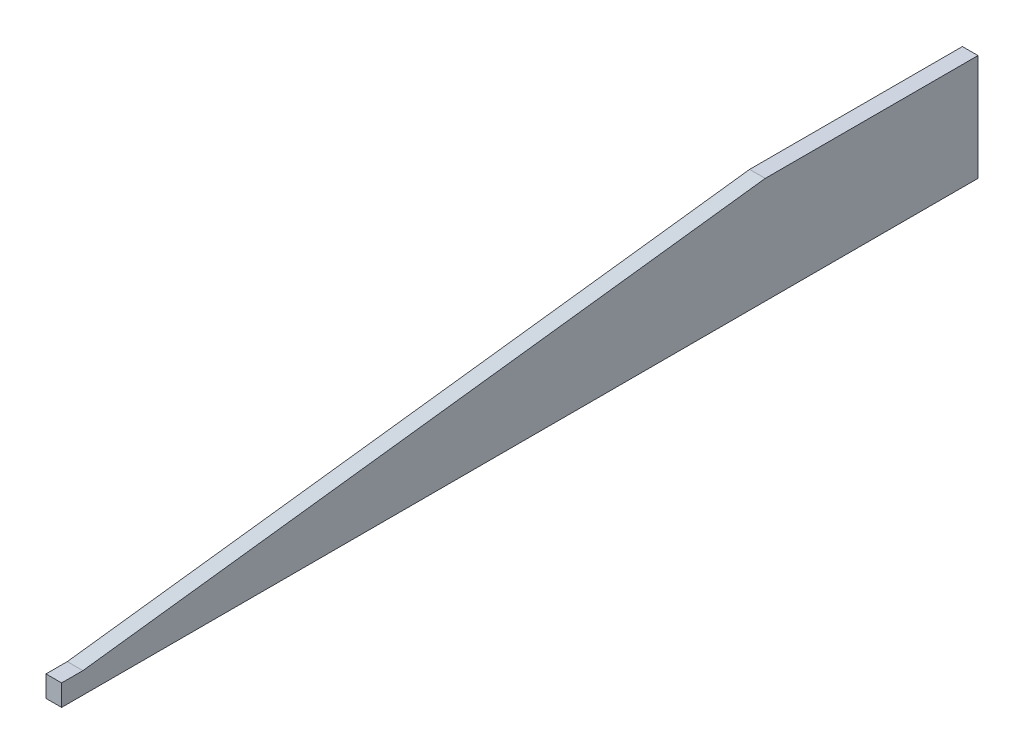
ISO-10303-21;
HEADER;
FILE_DESCRIPTION(('STEP AP214'),'2;1');
FILE_NAME('part.step','',(''),(''),'','','');
FILE_SCHEMA(('AUTOMOTIVE_DESIGN { 1 0 10303 214 1 1 1 1 }'));
ENDSEC;
DATA;
#1=APPLICATION_CONTEXT('core data for automotive mechanical design processes');
#2=APPLICATION_PROTOCOL_DEFINITION('international standard','automotive_design',2000,#1);
#3=PRODUCT_CONTEXT('',#1,'mechanical');
#4=PRODUCT('Part','Part','',(#3));
#5=PRODUCT_RELATED_PRODUCT_CATEGORY('part','',(#4));
#6=PRODUCT_DEFINITION_FORMATION('','',#4);
#7=PRODUCT_DEFINITION_CONTEXT('part definition',#1,'design');
#8=PRODUCT_DEFINITION('design','',#6,#7);
#9=PRODUCT_DEFINITION_SHAPE('','',#8);
#10=(LENGTH_UNIT() NAMED_UNIT(*) SI_UNIT(.MILLI.,.METRE.));
#11=(NAMED_UNIT(*) PLANE_ANGLE_UNIT() SI_UNIT($,.RADIAN.));
#12=(NAMED_UNIT(*) SI_UNIT($,.STERADIAN.) SOLID_ANGLE_UNIT());
#13=UNCERTAINTY_MEASURE_WITH_UNIT(LENGTH_MEASURE(1.E-05),#10,'distance_accuracy_value','');
#14=(GEOMETRIC_REPRESENTATION_CONTEXT(3) GLOBAL_UNCERTAINTY_ASSIGNED_CONTEXT((#13)) GLOBAL_UNIT_ASSIGNED_CONTEXT((#10,
#11,#12)) REPRESENTATION_CONTEXT('',''));
#15=CARTESIAN_POINT('',(0.,0.,0.));
#16=DIRECTION('',(0.,0.,1.));
#17=DIRECTION('',(1.,0.,0.));
#18=AXIS2_PLACEMENT_3D('',#15,#16,#17);
#19=CARTESIAN_POINT('',(-11.,75.,1292.));
#20=DIRECTION('',(1.,0.,0.));
#21=DIRECTION('',(0.,1.,0.));
#22=AXIS2_PLACEMENT_3D('',#19,#20,#21);
#23=PLANE('',#22);
#24=DIRECTION('',(0.,0.,-1.));
#25=VECTOR('',#24,1.);
#26=CARTESIAN_POINT('',(-11.,-45.,1262.));
#27=LINE('',#26,#25);
#28=CARTESIAN_POINT('',(-11.,-45.,1292.));
#29=VERTEX_POINT('',#28);
#30=CARTESIAN_POINT('',(-11.,-45.,1262.));
#31=VERTEX_POINT('',#30);
#32=EDGE_CURVE('E46',#29,#31,#27,.T.);
#33=ORIENTED_EDGE('',*,*,#32,.T.);
#34=DIRECTION('',(0.,0.123780821151756,-0.992309582899912));
#35=VECTOR('',#34,1.);
#36=CARTESIAN_POINT('',(-11.,75.,300.));
#37=LINE('',#36,#35);
#38=CARTESIAN_POINT('',(-11.,75.,300.));
#39=VERTEX_POINT('',#38);
#40=EDGE_CURVE('E81',#31,#39,#37,.T.);
#41=ORIENTED_EDGE('',*,*,#40,.T.);
#42=DIRECTION('',(0.,0.,-1.));
#43=VECTOR('',#42,1.);
#44=CARTESIAN_POINT('',(-11.,75.,1292.));
#45=LINE('',#44,#43);
#46=CARTESIAN_POINT('',(-11.,75.,0.));
#47=VERTEX_POINT('',#46);
#48=EDGE_CURVE('E75',#39,#47,#45,.T.);
#49=ORIENTED_EDGE('',*,*,#48,.T.);
#50=DIRECTION('',(0.,-1.,0.));
#51=VECTOR('',#50,1.);
#52=CARTESIAN_POINT('',(-11.,75.,0.));
#53=LINE('',#52,#51);
#54=CARTESIAN_POINT('',(-11.,-75.,0.));
#55=VERTEX_POINT('',#54);
#56=EDGE_CURVE('E79',#47,#55,#53,.T.);
#57=ORIENTED_EDGE('',*,*,#56,.T.);
#58=DIRECTION('',(0.,0.,-1.));
#59=VECTOR('',#58,1.);
#60=CARTESIAN_POINT('',(-11.,-75.,1292.));
#61=LINE('',#60,#59);
#62=CARTESIAN_POINT('',(-11.,-75.,1292.));
#63=VERTEX_POINT('',#62);
#64=EDGE_CURVE('E11',#63,#55,#61,.T.);
#65=ORIENTED_EDGE('',*,*,#64,.F.);
#66=DIRECTION('',(0.,-1.,0.));
#67=VECTOR('',#66,1.);
#68=CARTESIAN_POINT('',(-11.,75.,1292.));
#69=LINE('',#68,#67);
#70=EDGE_CURVE('E94',#29,#63,#69,.T.);
#71=ORIENTED_EDGE('',*,*,#70,.F.);
#72=EDGE_LOOP('',(#33,#41,#49,#57,#65,#71));
#73=FACE_BOUND('',#72,.T.);
#74=ADVANCED_FACE('F32',(#73),#23,.F.);
#75=CARTESIAN_POINT('',(-11.,-75.,1292.));
#76=DIRECTION('',(0.,1.,0.));
#77=DIRECTION('',(0.,0.,1.));
#78=AXIS2_PLACEMENT_3D('',#75,#76,#77);
#79=PLANE('',#78);
#80=DIRECTION('',(1.,0.,0.));
#81=VECTOR('',#80,1.);
#82=CARTESIAN_POINT('',(-11.,-75.,0.));
#83=LINE('',#82,#81);
#84=CARTESIAN_POINT('',(11.,-75.,0.));
#85=VERTEX_POINT('',#84);
#86=EDGE_CURVE('E98',#55,#85,#83,.T.);
#87=ORIENTED_EDGE('',*,*,#86,.T.);
#88=DIRECTION('',(0.,0.,-1.));
#89=VECTOR('',#88,1.);
#90=CARTESIAN_POINT('',(11.,-75.,1292.));
#91=LINE('',#90,#89);
#92=CARTESIAN_POINT('',(11.,-75.,1292.));
#93=VERTEX_POINT('',#92);
#94=EDGE_CURVE('E39',#93,#85,#91,.T.);
#95=ORIENTED_EDGE('',*,*,#94,.F.);
#96=DIRECTION('',(1.,0.,0.));
#97=VECTOR('',#96,1.);
#98=CARTESIAN_POINT('',(-11.,-75.,1292.));
#99=LINE('',#98,#97);
#100=EDGE_CURVE('E55',#63,#93,#99,.T.);
#101=ORIENTED_EDGE('',*,*,#100,.F.);
#102=ORIENTED_EDGE('',*,*,#64,.T.);
#103=EDGE_LOOP('',(#87,#95,#101,#102));
#104=FACE_BOUND('',#103,.T.);
#105=ADVANCED_FACE('F114',(#104),#79,.F.);
#106=CARTESIAN_POINT('',(11.,75.,1292.));
#107=DIRECTION('',(-1.,0.,0.));
#108=DIRECTION('',(0.,-1.,0.));
#109=AXIS2_PLACEMENT_3D('',#106,#107,#108);
#110=PLANE('',#109);
#111=DIRECTION('',(0.,0.,-1.));
#112=VECTOR('',#111,1.);
#113=CARTESIAN_POINT('',(11.,75.,1292.));
#114=LINE('',#113,#112);
#115=CARTESIAN_POINT('',(11.,75.,300.));
#116=VERTEX_POINT('',#115);
#117=CARTESIAN_POINT('',(11.,75.,0.));
#118=VERTEX_POINT('',#117);
#119=EDGE_CURVE('E84',#116,#118,#114,.T.);
#120=ORIENTED_EDGE('',*,*,#119,.F.);
#121=DIRECTION('',(0.,0.123780821151756,-0.992309582899912));
#122=VECTOR('',#121,1.);
#123=CARTESIAN_POINT('',(11.,75.,300.));
#124=LINE('',#123,#122);
#125=CARTESIAN_POINT('',(11.,-45.,1262.));
#126=VERTEX_POINT('',#125);
#127=EDGE_CURVE('E123',#126,#116,#124,.T.);
#128=ORIENTED_EDGE('',*,*,#127,.F.);
#129=DIRECTION('',(0.,0.,-1.));
#130=VECTOR('',#129,1.);
#131=CARTESIAN_POINT('',(11.,-45.,1262.));
#132=LINE('',#131,#130);
#133=CARTESIAN_POINT('',(11.,-45.,1292.));
#134=VERTEX_POINT('',#133);
#135=EDGE_CURVE('E126',#134,#126,#132,.T.);
#136=ORIENTED_EDGE('',*,*,#135,.F.);
#137=DIRECTION('',(0.,1.,0.));
#138=VECTOR('',#137,1.);
#139=CARTESIAN_POINT('',(11.,75.,1292.));
#140=LINE('',#139,#138);
#141=EDGE_CURVE('E85',#93,#134,#140,.T.);
#142=ORIENTED_EDGE('',*,*,#141,.F.);
#143=ORIENTED_EDGE('',*,*,#94,.T.);
#144=DIRECTION('',(0.,1.,0.));
#145=VECTOR('',#144,1.);
#146=CARTESIAN_POINT('',(11.,75.,0.));
#147=LINE('',#146,#145);
#148=EDGE_CURVE('E95',#85,#118,#147,.T.);
#149=ORIENTED_EDGE('',*,*,#148,.T.);
#150=EDGE_LOOP('',(#120,#128,#136,#142,#143,#149));
#151=FACE_BOUND('',#150,.T.);
#152=ADVANCED_FACE('F111',(#151),#110,.F.);
#153=CARTESIAN_POINT('',(-11.,75.,1292.));
#154=DIRECTION('',(0.,-1.,0.));
#155=DIRECTION('',(0.,0.,-1.));
#156=AXIS2_PLACEMENT_3D('',#153,#154,#155);
#157=PLANE('',#156);
#158=ORIENTED_EDGE('',*,*,#48,.F.);
#159=DIRECTION('',(1.,0.,0.));
#160=VECTOR('',#159,1.);
#161=CARTESIAN_POINT('',(-11.,75.,300.));
#162=LINE('',#161,#160);
#163=EDGE_CURVE('E99',#39,#116,#162,.T.);
#164=ORIENTED_EDGE('',*,*,#163,.T.);
#165=ORIENTED_EDGE('',*,*,#119,.T.);
#166=DIRECTION('',(-1.,0.,0.));
#167=VECTOR('',#166,1.);
#168=CARTESIAN_POINT('',(-11.,75.,0.));
#169=LINE('',#168,#167);
#170=EDGE_CURVE('E88',#118,#47,#169,.T.);
#171=ORIENTED_EDGE('',*,*,#170,.T.);
#172=EDGE_LOOP('',(#158,#164,#165,#171));
#173=FACE_BOUND('',#172,.T.);
#174=ADVANCED_FACE('F89',(#173),#157,.F.);
#175=CARTESIAN_POINT('',(0.,0.,1292.));
#176=DIRECTION('',(0.,0.,1.));
#177=DIRECTION('',(1.,0.,0.));
#178=AXIS2_PLACEMENT_3D('',#175,#176,#177);
#179=PLANE('',#178);
#180=DIRECTION('',(1.,0.,0.));
#181=VECTOR('',#180,1.);
#182=CARTESIAN_POINT('',(-11.,-45.,1292.));
#183=LINE('',#182,#181);
#184=EDGE_CURVE('E119',#29,#134,#183,.T.);
#185=ORIENTED_EDGE('',*,*,#184,.F.);
#186=ORIENTED_EDGE('',*,*,#70,.T.);
#187=ORIENTED_EDGE('',*,*,#100,.T.);
#188=ORIENTED_EDGE('',*,*,#141,.T.);
#189=EDGE_LOOP('',(#185,#186,#187,#188));
#190=FACE_BOUND('',#189,.T.);
#191=ADVANCED_FACE('F149',(#190),#179,.T.);
#192=CARTESIAN_POINT('',(0.,0.,0.));
#193=DIRECTION('',(0.,0.,1.));
#194=DIRECTION('',(1.,0.,0.));
#195=AXIS2_PLACEMENT_3D('',#192,#193,#194);
#196=PLANE('',#195);
#197=ORIENTED_EDGE('',*,*,#56,.F.);
#198=ORIENTED_EDGE('',*,*,#170,.F.);
#199=ORIENTED_EDGE('',*,*,#148,.F.);
#200=ORIENTED_EDGE('',*,*,#86,.F.);
#201=EDGE_LOOP('',(#197,#198,#199,#200));
#202=FACE_BOUND('',#201,.T.);
#203=ADVANCED_FACE('F97',(#202),#196,.F.);
#204=CARTESIAN_POINT('',(-11.,75.,300.));
#205=DIRECTION('',(0.,-0.992309582899912,-0.123780821151756));
#206=DIRECTION('',(0.,0.123780821151756,-0.992309582899912));
#207=AXIS2_PLACEMENT_3D('',#204,#205,#206);
#208=PLANE('',#207);
#209=ORIENTED_EDGE('',*,*,#127,.T.);
#210=ORIENTED_EDGE('',*,*,#163,.F.);
#211=ORIENTED_EDGE('',*,*,#40,.F.);
#212=DIRECTION('',(1.,0.,0.));
#213=VECTOR('',#212,1.);
#214=CARTESIAN_POINT('',(-11.,-45.,1262.));
#215=LINE('',#214,#213);
#216=EDGE_CURVE('E102',#31,#126,#215,.T.);
#217=ORIENTED_EDGE('',*,*,#216,.T.);
#218=EDGE_LOOP('',(#209,#210,#211,#217));
#219=FACE_BOUND('',#218,.T.);
#220=ADVANCED_FACE('F138',(#219),#208,.F.);
#221=CARTESIAN_POINT('',(-11.,-45.,1262.));
#222=DIRECTION('',(0.,-1.,0.));
#223=DIRECTION('',(0.,0.,-1.));
#224=AXIS2_PLACEMENT_3D('',#221,#222,#223);
#225=PLANE('',#224);
#226=ORIENTED_EDGE('',*,*,#135,.T.);
#227=ORIENTED_EDGE('',*,*,#216,.F.);
#228=ORIENTED_EDGE('',*,*,#32,.F.);
#229=ORIENTED_EDGE('',*,*,#184,.T.);
#230=EDGE_LOOP('',(#226,#227,#228,#229));
#231=FACE_BOUND('',#230,.T.);
#232=ADVANCED_FACE('F132',(#231),#225,.F.);
#233=CLOSED_SHELL('',(#74,#105,#152,#174,#191,#203,#220,#232));
#234=MANIFOLD_SOLID_BREP('B2',#233);
#235=ADVANCED_BREP_SHAPE_REPRESENTATION('',(#18,#234),#14);
#236=SHAPE_DEFINITION_REPRESENTATION(#9,#235);
ENDSEC;
END-ISO-10303-21;
